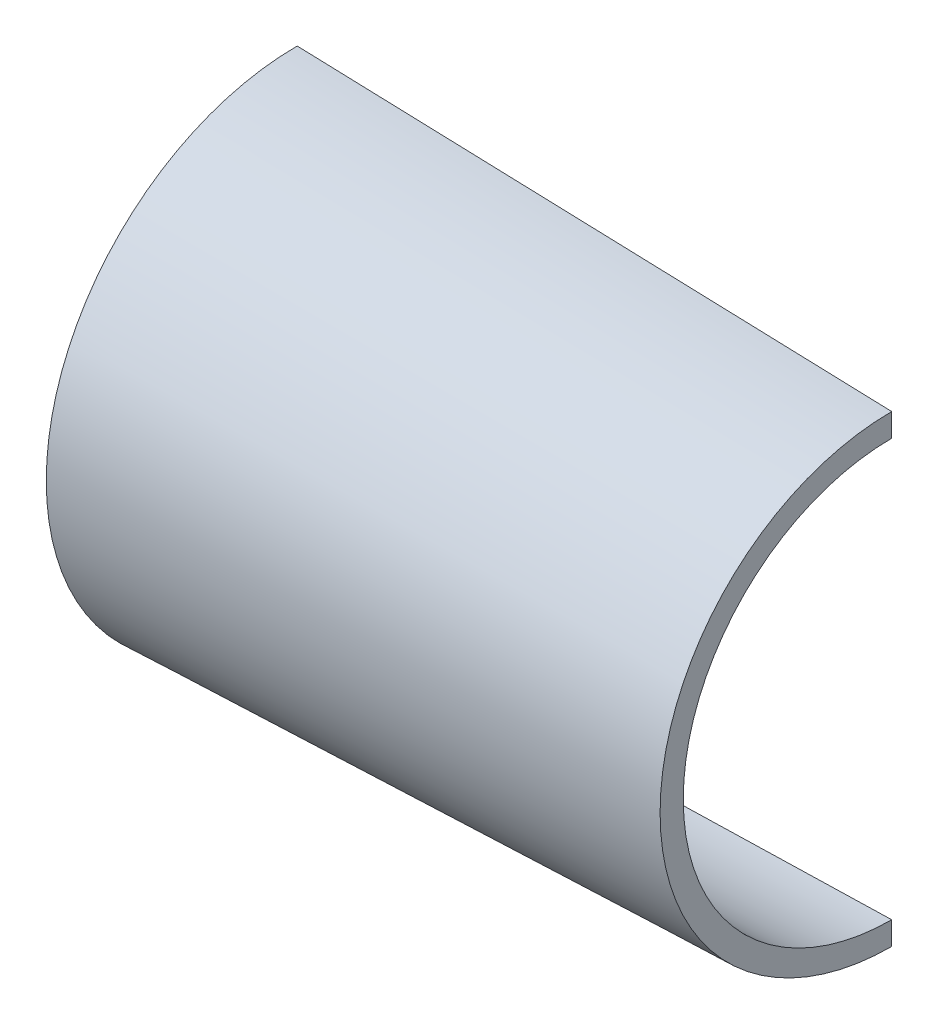
ISO-10303-21;
HEADER;
FILE_DESCRIPTION(('STEP AP214'),'2;1');
FILE_NAME('part.step','',(''),(''),'','','');
FILE_SCHEMA(('AUTOMOTIVE_DESIGN { 1 0 10303 214 1 1 1 1 }'));
ENDSEC;
DATA;
#1=APPLICATION_CONTEXT('core data for automotive mechanical design processes');
#2=APPLICATION_PROTOCOL_DEFINITION('international standard','automotive_design',2000,#1);
#3=PRODUCT_CONTEXT('',#1,'mechanical');
#4=PRODUCT('Part','Part','',(#3));
#5=PRODUCT_RELATED_PRODUCT_CATEGORY('part','',(#4));
#6=PRODUCT_DEFINITION_FORMATION('','',#4);
#7=PRODUCT_DEFINITION_CONTEXT('part definition',#1,'design');
#8=PRODUCT_DEFINITION('design','',#6,#7);
#9=PRODUCT_DEFINITION_SHAPE('','',#8);
#10=(LENGTH_UNIT() NAMED_UNIT(*) SI_UNIT(.MILLI.,.METRE.));
#11=(NAMED_UNIT(*) PLANE_ANGLE_UNIT() SI_UNIT($,.RADIAN.));
#12=(NAMED_UNIT(*) SI_UNIT($,.STERADIAN.) SOLID_ANGLE_UNIT());
#13=UNCERTAINTY_MEASURE_WITH_UNIT(LENGTH_MEASURE(1.E-05),#10,'distance_accuracy_value','');
#14=(GEOMETRIC_REPRESENTATION_CONTEXT(3) GLOBAL_UNCERTAINTY_ASSIGNED_CONTEXT((#13)) GLOBAL_UNIT_ASSIGNED_CONTEXT((#10,
#11,#12)) REPRESENTATION_CONTEXT('',''));
#15=CARTESIAN_POINT('',(0.,0.,0.));
#16=DIRECTION('',(0.,0.,1.));
#17=DIRECTION('',(1.,0.,0.));
#18=AXIS2_PLACEMENT_3D('',#15,#16,#17);
#19=CARTESIAN_POINT('',(1880.,0.,0.));
#20=DIRECTION('',(-1.,0.,0.));
#21=DIRECTION('',(0.,0.,1.));
#22=AXIS2_PLACEMENT_3D('',#19,#20,#21);
#23=CONICAL_SURFACE('',#22,580.,0.0259681872115563);
#24=CARTESIAN_POINT('',(1880.,0.,0.));
#25=DIRECTION('',(-1.,0.,0.));
#26=DIRECTION('',(0.,0.,1.));
#27=AXIS2_PLACEMENT_3D('',#24,#25,#26);
#28=CIRCLE('',#27,580.);
#29=CARTESIAN_POINT('',(1880.,-579.999999999999,3.10820800386332E-05));
#30=VERTEX_POINT('',#29);
#31=CARTESIAN_POINT('',(1880.,580.,0.));
#32=VERTEX_POINT('',#31);
#33=EDGE_CURVE('E11',#30,#32,#28,.T.);
#34=ORIENTED_EDGE('',*,*,#33,.T.);
#35=DIRECTION('',(0.999662845573694,-0.0259652687161998,0.));
#36=VECTOR('',#35,1.);
#37=CARTESIAN_POINT('',(3420.,540.,0.));
#38=LINE('',#37,#36);
#39=CARTESIAN_POINT('',(3420.,540.,0.));
#40=VERTEX_POINT('',#39);
#41=EDGE_CURVE('E100',#32,#40,#38,.T.);
#42=ORIENTED_EDGE('',*,*,#41,.T.);
#43=CARTESIAN_POINT('',(3420.,0.,0.));
#44=DIRECTION('',(-1.,0.,0.));
#45=DIRECTION('',(0.,0.,1.));
#46=AXIS2_PLACEMENT_3D('',#43,#44,#45);
#47=CIRCLE('',#46,540.);
#48=CARTESIAN_POINT('',(3420.,-539.999999999999,2.89384883118309E-05));
#49=VERTEX_POINT('',#48);
#50=EDGE_CURVE('E80',#49,#40,#47,.T.);
#51=ORIENTED_EDGE('',*,*,#50,.F.);
#52=DIRECTION('',(0.999662845573694,0.0259652687161998,-1.39147338010611E-09));
#53=VECTOR('',#52,1.);
#54=CARTESIAN_POINT('',(3420.,-539.999999999999,2.89384883118309E-05));
#55=LINE('',#54,#53);
#56=EDGE_CURVE('E103',#30,#49,#55,.T.);
#57=ORIENTED_EDGE('',*,*,#56,.F.);
#58=EDGE_LOOP('',(#34,#42,#51,#57));
#59=FACE_BOUND('',#58,.T.);
#60=ADVANCED_FACE('F39',(#59),#23,.F.);
#61=CARTESIAN_POINT('',(1880.,-579.999999999999,3.10820800386332E-05));
#62=DIRECTION('',(1.,0.,0.));
#63=DIRECTION('',(0.,0.,-1.));
#64=AXIS2_PLACEMENT_3D('',#61,#62,#63);
#65=PLANE('',#64);
#66=CARTESIAN_POINT('',(1880.,0.,0.));
#67=DIRECTION('',(-1.,0.,0.));
#68=DIRECTION('',(0.,0.,1.));
#69=AXIS2_PLACEMENT_3D('',#66,#67,#68);
#70=CIRCLE('',#69,650.);
#71=CARTESIAN_POINT('',(1880.,-649.999999999999,3.48333655605372E-05));
#72=VERTEX_POINT('',#71);
#73=CARTESIAN_POINT('',(1880.,650.,0.));
#74=VERTEX_POINT('',#73);
#75=EDGE_CURVE('E50',#72,#74,#70,.T.);
#76=ORIENTED_EDGE('',*,*,#75,.T.);
#77=DIRECTION('',(0.,-1.,0.));
#78=VECTOR('',#77,1.);
#79=CARTESIAN_POINT('',(1880.,580.,0.));
#80=LINE('',#79,#78);
#81=EDGE_CURVE('E104',#74,#32,#80,.T.);
#82=ORIENTED_EDGE('',*,*,#81,.T.);
#83=ORIENTED_EDGE('',*,*,#33,.F.);
#84=DIRECTION('',(0.,0.999999999999999,-5.35897931700572E-08));
#85=VECTOR('',#84,1.);
#86=CARTESIAN_POINT('',(1880.,-579.999999999999,3.10820800386332E-05));
#87=LINE('',#86,#85);
#88=EDGE_CURVE('E91',#72,#30,#87,.T.);
#89=ORIENTED_EDGE('',*,*,#88,.F.);
#90=EDGE_LOOP('',(#76,#82,#83,#89));
#91=FACE_BOUND('',#90,.T.);
#92=ADVANCED_FACE('F41',(#91),#65,.F.);
#93=CARTESIAN_POINT('',(3420.,0.,0.));
#94=DIRECTION('',(-1.,0.,0.));
#95=DIRECTION('',(0.,0.,1.));
#96=AXIS2_PLACEMENT_3D('',#93,#94,#95);
#97=CONICAL_SURFACE('',#96,600.,0.0324561312290194);
#98=CARTESIAN_POINT('',(3420.,0.,0.));
#99=DIRECTION('',(-1.,0.,0.));
#100=DIRECTION('',(0.,0.,1.));
#101=AXIS2_PLACEMENT_3D('',#98,#99,#100);
#102=CIRCLE('',#101,600.);
#103=CARTESIAN_POINT('',(3420.,-599.999999999999,3.21538759020343E-05));
#104=VERTEX_POINT('',#103);
#105=CARTESIAN_POINT('',(3420.,600.,0.));
#106=VERTEX_POINT('',#105);
#107=EDGE_CURVE('E89',#104,#106,#102,.T.);
#108=ORIENTED_EDGE('',*,*,#107,.T.);
#109=DIRECTION('',(-0.999473346006721,0.0324504333119065,0.));
#110=VECTOR('',#109,1.);
#111=CARTESIAN_POINT('',(1880.,650.,0.));
#112=LINE('',#111,#110);
#113=EDGE_CURVE('E97',#106,#74,#112,.T.);
#114=ORIENTED_EDGE('',*,*,#113,.T.);
#115=ORIENTED_EDGE('',*,*,#75,.F.);
#116=DIRECTION('',(-0.999473346006721,-0.0324504333119065,1.73901200946381E-09));
#117=VECTOR('',#116,1.);
#118=CARTESIAN_POINT('',(1880.,-649.999999999999,3.48333655605372E-05));
#119=LINE('',#118,#117);
#120=EDGE_CURVE('E109',#104,#72,#119,.T.);
#121=ORIENTED_EDGE('',*,*,#120,.F.);
#122=EDGE_LOOP('',(#108,#114,#115,#121));
#123=FACE_BOUND('',#122,.T.);
#124=ADVANCED_FACE('F112',(#123),#97,.T.);
#125=CARTESIAN_POINT('',(3420.,-599.999999999999,3.21538759020343E-05));
#126=DIRECTION('',(-1.,0.,0.));
#127=DIRECTION('',(0.,0.,1.));
#128=AXIS2_PLACEMENT_3D('',#125,#126,#127);
#129=PLANE('',#128);
#130=DIRECTION('',(0.,-0.999999999999999,5.35897931700572E-08));
#131=VECTOR('',#130,1.);
#132=CARTESIAN_POINT('',(3420.,-599.999999999999,3.21538759020343E-05));
#133=LINE('',#132,#131);
#134=EDGE_CURVE('E82',#49,#104,#133,.T.);
#135=ORIENTED_EDGE('',*,*,#134,.F.);
#136=ORIENTED_EDGE('',*,*,#50,.T.);
#137=DIRECTION('',(0.,1.,0.));
#138=VECTOR('',#137,1.);
#139=CARTESIAN_POINT('',(3420.,600.,0.));
#140=LINE('',#139,#138);
#141=EDGE_CURVE('E85',#40,#106,#140,.T.);
#142=ORIENTED_EDGE('',*,*,#141,.T.);
#143=ORIENTED_EDGE('',*,*,#107,.F.);
#144=EDGE_LOOP('',(#135,#136,#142,#143));
#145=FACE_BOUND('',#144,.T.);
#146=ADVANCED_FACE('F83',(#145),#129,.F.);
#147=CARTESIAN_POINT('',(0.,0.,0.));
#148=DIRECTION('',(0.,5.35897931700572E-08,0.999999999999999));
#149=DIRECTION('',(-1.,0.,0.));
#150=AXIS2_PLACEMENT_3D('',#147,#148,#149);
#151=PLANE('',#150);
#152=ORIENTED_EDGE('',*,*,#56,.T.);
#153=ORIENTED_EDGE('',*,*,#134,.T.);
#154=ORIENTED_EDGE('',*,*,#120,.T.);
#155=ORIENTED_EDGE('',*,*,#88,.T.);
#156=EDGE_LOOP('',(#152,#153,#154,#155));
#157=FACE_BOUND('',#156,.T.);
#158=ADVANCED_FACE('F111',(#157),#151,.F.);
#159=CARTESIAN_POINT('',(0.,0.,0.));
#160=DIRECTION('',(0.,0.,-1.));
#161=DIRECTION('',(-1.,0.,0.));
#162=AXIS2_PLACEMENT_3D('',#159,#160,#161);
#163=PLANE('',#162);
#164=ORIENTED_EDGE('',*,*,#41,.F.);
#165=ORIENTED_EDGE('',*,*,#81,.F.);
#166=ORIENTED_EDGE('',*,*,#113,.F.);
#167=ORIENTED_EDGE('',*,*,#141,.F.);
#168=EDGE_LOOP('',(#164,#165,#166,#167));
#169=FACE_BOUND('',#168,.T.);
#170=ADVANCED_FACE('F94',(#169),#163,.T.);
#171=CLOSED_SHELL('',(#60,#92,#124,#146,#158,#170));
#172=MANIFOLD_SOLID_BREP('B2',#171);
#173=ADVANCED_BREP_SHAPE_REPRESENTATION('',(#18,#172),#14);
#174=SHAPE_DEFINITION_REPRESENTATION(#9,#173);
ENDSEC;
END-ISO-10303-21;
